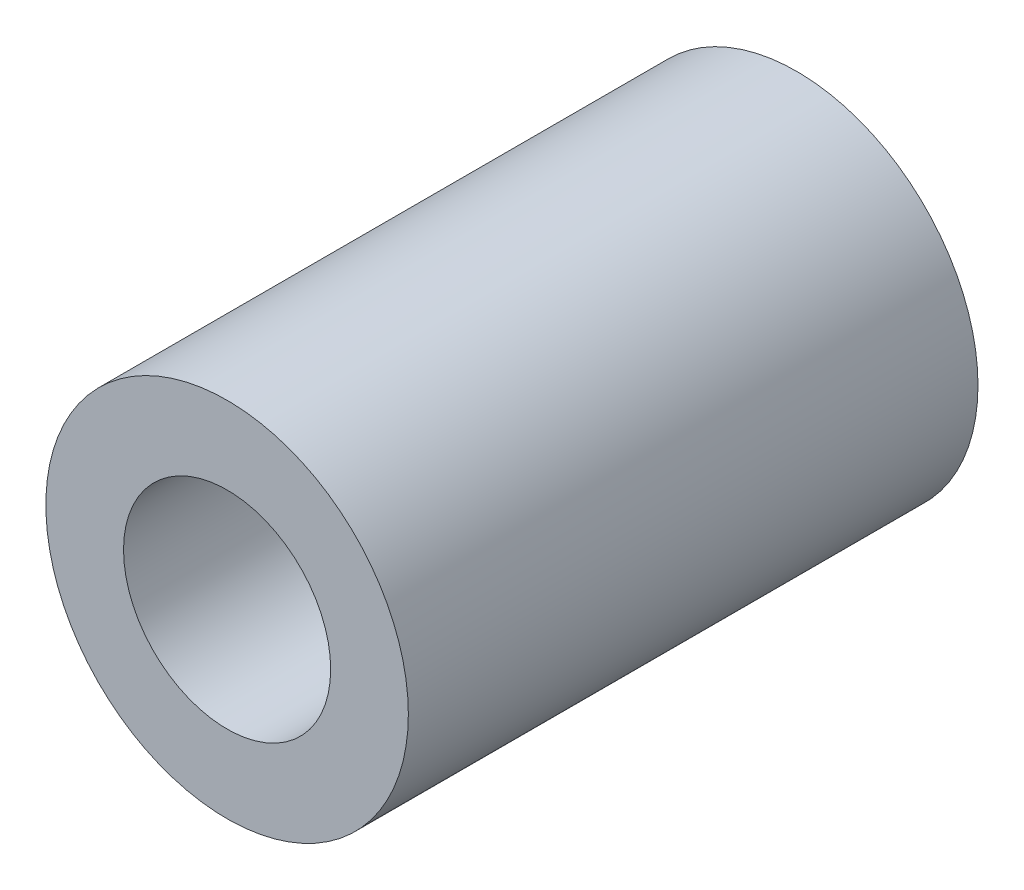
ISO-10303-21;
HEADER;
FILE_DESCRIPTION(('STEP AP214'),'2;1');
FILE_NAME('part.step','',(''),(''),'','','');
FILE_SCHEMA(('AUTOMOTIVE_DESIGN { 1 0 10303 214 1 1 1 1 }'));
ENDSEC;
DATA;
#1=APPLICATION_CONTEXT('core data for automotive mechanical design processes');
#2=APPLICATION_PROTOCOL_DEFINITION('international standard','automotive_design',2000,#1);
#3=PRODUCT_CONTEXT('',#1,'mechanical');
#4=PRODUCT('Part','Part','',(#3));
#5=PRODUCT_RELATED_PRODUCT_CATEGORY('part','',(#4));
#6=PRODUCT_DEFINITION_FORMATION('','',#4);
#7=PRODUCT_DEFINITION_CONTEXT('part definition',#1,'design');
#8=PRODUCT_DEFINITION('design','',#6,#7);
#9=PRODUCT_DEFINITION_SHAPE('','',#8);
#10=(LENGTH_UNIT() NAMED_UNIT(*) SI_UNIT(.MILLI.,.METRE.));
#11=(NAMED_UNIT(*) PLANE_ANGLE_UNIT() SI_UNIT($,.RADIAN.));
#12=(NAMED_UNIT(*) SI_UNIT($,.STERADIAN.) SOLID_ANGLE_UNIT());
#13=UNCERTAINTY_MEASURE_WITH_UNIT(LENGTH_MEASURE(1.E-05),#10,'distance_accuracy_value','');
#14=(GEOMETRIC_REPRESENTATION_CONTEXT(3) GLOBAL_UNCERTAINTY_ASSIGNED_CONTEXT((#13)) GLOBAL_UNIT_ASSIGNED_CONTEXT((#10,
#11,#12)) REPRESENTATION_CONTEXT('',''));
#15=CARTESIAN_POINT('',(0.,0.,0.));
#16=DIRECTION('',(0.,0.,1.));
#17=DIRECTION('',(1.,0.,0.));
#18=AXIS2_PLACEMENT_3D('',#15,#16,#17);
#19=CARTESIAN_POINT('',(0.,0.,22.));
#20=DIRECTION('',(0.,0.,-1.));
#21=DIRECTION('',(-1.,0.,0.));
#22=AXIS2_PLACEMENT_3D('',#19,#20,#21);
#23=CYLINDRICAL_SURFACE('',#22,2.5);
#24=CARTESIAN_POINT('',(0.,0.,0.));
#25=DIRECTION('',(0.,0.,1.));
#26=DIRECTION('',(1.,0.,0.));
#27=AXIS2_PLACEMENT_3D('',#24,#25,#26);
#28=CIRCLE('',#27,2.5);
#29=CARTESIAN_POINT('',(2.5,0.,0.));
#30=VERTEX_POINT('',#29);
#31=EDGE_CURVE('E52',#30,#30,#28,.T.);
#32=ORIENTED_EDGE('',*,*,#31,.F.);
#33=EDGE_LOOP('',(#32));
#34=FACE_BOUND('',#33,.T.);
#35=CARTESIAN_POINT('',(0.,0.,11.));
#36=DIRECTION('',(0.,0.,1.));
#37=DIRECTION('',(1.,0.,0.));
#38=AXIS2_PLACEMENT_3D('',#35,#36,#37);
#39=CIRCLE('',#38,2.5);
#40=CARTESIAN_POINT('',(2.5,0.,11.));
#41=VERTEX_POINT('',#40);
#42=EDGE_CURVE('E41',#41,#41,#39,.T.);
#43=ORIENTED_EDGE('',*,*,#42,.T.);
#44=EDGE_LOOP('',(#43));
#45=FACE_BOUND('',#44,.T.);
#46=ADVANCED_FACE('F37',(#34,#45),#23,.F.);
#47=CARTESIAN_POINT('',(0.,0.,22.));
#48=DIRECTION('',(0.,0.,1.));
#49=DIRECTION('',(1.,0.,0.));
#50=AXIS2_PLACEMENT_3D('',#47,#48,#49);
#51=PLANE('',#50);
#52=CARTESIAN_POINT('',(0.,0.,22.));
#53=DIRECTION('',(0.,0.,1.));
#54=DIRECTION('',(1.,0.,0.));
#55=AXIS2_PLACEMENT_3D('',#52,#53,#54);
#56=CIRCLE('',#55,4.);
#57=CARTESIAN_POINT('',(4.,0.,22.));
#58=VERTEX_POINT('',#57);
#59=EDGE_CURVE('E57',#58,#58,#56,.T.);
#60=ORIENTED_EDGE('',*,*,#59,.F.);
#61=EDGE_LOOP('',(#60));
#62=FACE_BOUND('',#61,.T.);
#63=CARTESIAN_POINT('',(0.,0.,22.));
#64=DIRECTION('',(0.,0.,1.));
#65=DIRECTION('',(1.,0.,0.));
#66=AXIS2_PLACEMENT_3D('',#63,#64,#65);
#67=CIRCLE('',#66,7.);
#68=CARTESIAN_POINT('',(7.,0.,22.));
#69=VERTEX_POINT('',#68);
#70=EDGE_CURVE('E10',#69,#69,#67,.T.);
#71=ORIENTED_EDGE('',*,*,#70,.T.);
#72=EDGE_LOOP('',(#71));
#73=FACE_BOUND('',#72,.T.);
#74=ADVANCED_FACE('F81',(#62,#73),#51,.T.);
#75=CARTESIAN_POINT('',(0.,0.,0.));
#76=DIRECTION('',(0.,0.,1.));
#77=DIRECTION('',(1.,0.,0.));
#78=AXIS2_PLACEMENT_3D('',#75,#76,#77);
#79=PLANE('',#78);
#80=CARTESIAN_POINT('',(0.,0.,0.));
#81=DIRECTION('',(0.,0.,1.));
#82=DIRECTION('',(1.,0.,0.));
#83=AXIS2_PLACEMENT_3D('',#80,#81,#82);
#84=CIRCLE('',#83,7.);
#85=CARTESIAN_POINT('',(7.,0.,0.));
#86=VERTEX_POINT('',#85);
#87=EDGE_CURVE('E46',#86,#86,#84,.T.);
#88=ORIENTED_EDGE('',*,*,#87,.F.);
#89=EDGE_LOOP('',(#88));
#90=FACE_BOUND('',#89,.T.);
#91=ORIENTED_EDGE('',*,*,#31,.T.);
#92=EDGE_LOOP('',(#91));
#93=FACE_BOUND('',#92,.T.);
#94=ADVANCED_FACE('F87',(#90,#93),#79,.F.);
#95=CARTESIAN_POINT('',(0.,0.,22.));
#96=DIRECTION('',(0.,0.,-1.));
#97=DIRECTION('',(-1.,0.,0.));
#98=AXIS2_PLACEMENT_3D('',#95,#96,#97);
#99=CYLINDRICAL_SURFACE('',#98,7.);
#100=ORIENTED_EDGE('',*,*,#70,.F.);
#101=EDGE_LOOP('',(#100));
#102=FACE_BOUND('',#101,.T.);
#103=ORIENTED_EDGE('',*,*,#87,.T.);
#104=EDGE_LOOP('',(#103));
#105=FACE_BOUND('',#104,.T.);
#106=ADVANCED_FACE('F39',(#102,#105),#99,.T.);
#107=CARTESIAN_POINT('',(0.,0.,11.));
#108=DIRECTION('',(0.,0.,1.));
#109=DIRECTION('',(1.,0.,0.));
#110=AXIS2_PLACEMENT_3D('',#107,#108,#109);
#111=CYLINDRICAL_SURFACE('',#110,4.);
#112=CARTESIAN_POINT('',(0.,0.,11.));
#113=DIRECTION('',(0.,0.,1.));
#114=DIRECTION('',(1.,0.,0.));
#115=AXIS2_PLACEMENT_3D('',#112,#113,#114);
#116=CIRCLE('',#115,4.);
#117=CARTESIAN_POINT('',(4.,0.,11.));
#118=VERTEX_POINT('',#117);
#119=EDGE_CURVE('E61',#118,#118,#116,.T.);
#120=ORIENTED_EDGE('',*,*,#119,.F.);
#121=EDGE_LOOP('',(#120));
#122=FACE_BOUND('',#121,.T.);
#123=ORIENTED_EDGE('',*,*,#59,.T.);
#124=EDGE_LOOP('',(#123));
#125=FACE_BOUND('',#124,.T.);
#126=ADVANCED_FACE('F73',(#122,#125),#111,.F.);
#127=CARTESIAN_POINT('',(0.,0.,11.));
#128=DIRECTION('',(0.,0.,1.));
#129=DIRECTION('',(1.,0.,0.));
#130=AXIS2_PLACEMENT_3D('',#127,#128,#129);
#131=PLANE('',#130);
#132=ORIENTED_EDGE('',*,*,#42,.F.);
#133=EDGE_LOOP('',(#132));
#134=FACE_BOUND('',#133,.T.);
#135=ORIENTED_EDGE('',*,*,#119,.T.);
#136=EDGE_LOOP('',(#135));
#137=FACE_BOUND('',#136,.T.);
#138=ADVANCED_FACE('F71',(#134,#137),#131,.T.);
#139=CLOSED_SHELL('',(#46,#74,#94,#106,#126,#138));
#140=MANIFOLD_SOLID_BREP('B2',#139);
#141=ADVANCED_BREP_SHAPE_REPRESENTATION('',(#18,#140),#14);
#142=SHAPE_DEFINITION_REPRESENTATION(#9,#141);
ENDSEC;
END-ISO-10303-21;
